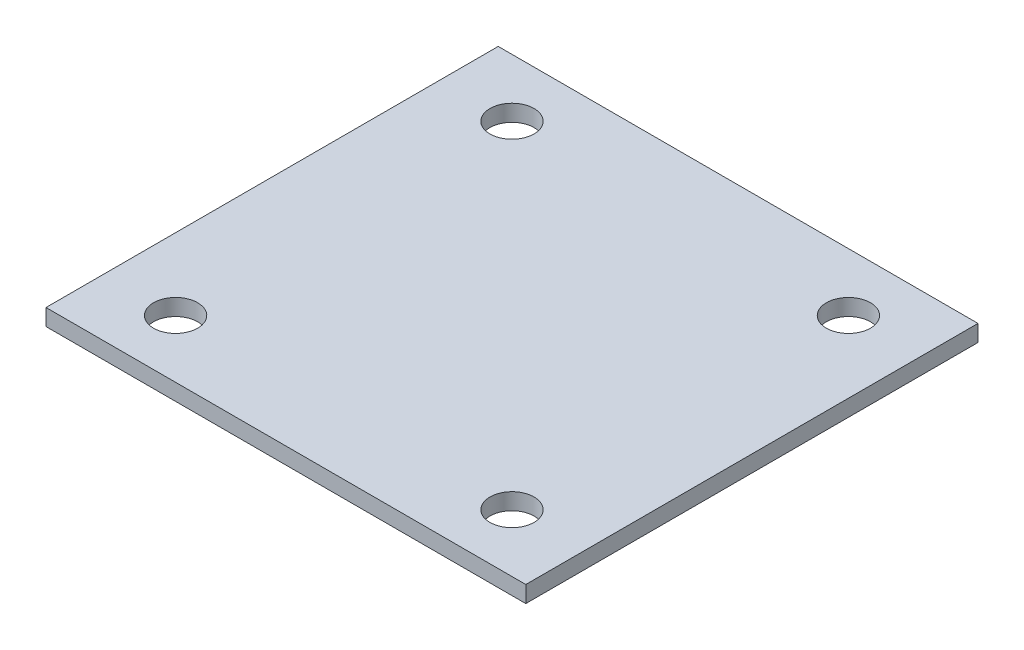
ISO-10303-21;
HEADER;
FILE_DESCRIPTION(('STEP AP214'),'2;1');
FILE_NAME('part.step','',(''),(''),'','','');
FILE_SCHEMA(('AUTOMOTIVE_DESIGN { 1 0 10303 214 1 1 1 1 }'));
ENDSEC;
DATA;
#1=APPLICATION_CONTEXT('core data for automotive mechanical design processes');
#2=APPLICATION_PROTOCOL_DEFINITION('international standard','automotive_design',2000,#1);
#3=PRODUCT_CONTEXT('',#1,'mechanical');
#4=PRODUCT('Part','Part','',(#3));
#5=PRODUCT_RELATED_PRODUCT_CATEGORY('part','',(#4));
#6=PRODUCT_DEFINITION_FORMATION('','',#4);
#7=PRODUCT_DEFINITION_CONTEXT('part definition',#1,'design');
#8=PRODUCT_DEFINITION('design','',#6,#7);
#9=PRODUCT_DEFINITION_SHAPE('','',#8);
#10=(LENGTH_UNIT() NAMED_UNIT(*) SI_UNIT(.MILLI.,.METRE.));
#11=(NAMED_UNIT(*) PLANE_ANGLE_UNIT() SI_UNIT($,.RADIAN.));
#12=(NAMED_UNIT(*) SI_UNIT($,.STERADIAN.) SOLID_ANGLE_UNIT());
#13=UNCERTAINTY_MEASURE_WITH_UNIT(LENGTH_MEASURE(1.E-05),#10,'distance_accuracy_value','');
#14=(GEOMETRIC_REPRESENTATION_CONTEXT(3) GLOBAL_UNCERTAINTY_ASSIGNED_CONTEXT((#13)) GLOBAL_UNIT_ASSIGNED_CONTEXT((#10,
#11,#12)) REPRESENTATION_CONTEXT('',''));
#15=CARTESIAN_POINT('',(0.,0.,0.));
#16=DIRECTION('',(0.,0.,1.));
#17=DIRECTION('',(1.,0.,0.));
#18=AXIS2_PLACEMENT_3D('',#15,#16,#17);
#19=CARTESIAN_POINT('',(0.,1.5,0.));
#20=DIRECTION('',(0.,-1.,0.));
#21=DIRECTION('',(0.,0.,-1.));
#22=AXIS2_PLACEMENT_3D('',#19,#20,#21);
#23=PLANE('',#22);
#24=DIRECTION('',(0.,0.,-1.));
#25=VECTOR('',#24,1.);
#26=CARTESIAN_POINT('',(21.75,1.5,20.5));
#27=LINE('',#26,#25);
#28=CARTESIAN_POINT('',(21.75,1.5,20.5));
#29=VERTEX_POINT('',#28);
#30=CARTESIAN_POINT('',(21.75,1.5,-20.5));
#31=VERTEX_POINT('',#30);
#32=EDGE_CURVE('E91',#29,#31,#27,.T.);
#33=ORIENTED_EDGE('',*,*,#32,.T.);
#34=DIRECTION('',(-1.,0.,0.));
#35=VECTOR('',#34,1.);
#36=CARTESIAN_POINT('',(-21.75,1.5,-20.5));
#37=LINE('',#36,#35);
#38=CARTESIAN_POINT('',(-21.75,1.5,-20.5));
#39=VERTEX_POINT('',#38);
#40=EDGE_CURVE('E86',#31,#39,#37,.T.);
#41=ORIENTED_EDGE('',*,*,#40,.T.);
#42=DIRECTION('',(0.,0.,1.));
#43=VECTOR('',#42,1.);
#44=CARTESIAN_POINT('',(-21.75,1.5,20.5));
#45=LINE('',#44,#43);
#46=CARTESIAN_POINT('',(-21.75,1.5,20.5));
#47=VERTEX_POINT('',#46);
#48=EDGE_CURVE('E89',#39,#47,#45,.T.);
#49=ORIENTED_EDGE('',*,*,#48,.T.);
#50=DIRECTION('',(1.,0.,0.));
#51=VECTOR('',#50,1.);
#52=CARTESIAN_POINT('',(-21.75,1.5,20.5));
#53=LINE('',#52,#51);
#54=EDGE_CURVE('E56',#47,#29,#53,.T.);
#55=ORIENTED_EDGE('',*,*,#54,.T.);
#56=EDGE_LOOP('',(#33,#41,#49,#55));
#57=FACE_BOUND('',#56,.T.);
#58=CARTESIAN_POINT('',(-15.25,1.5,-15.25));
#59=DIRECTION('',(0.,1.,0.));
#60=DIRECTION('',(0.,0.,1.));
#61=AXIS2_PLACEMENT_3D('',#58,#59,#60);
#62=CIRCLE('',#61,2.);
#63=CARTESIAN_POINT('',(-15.25,1.5,-13.25));
#64=VERTEX_POINT('',#63);
#65=EDGE_CURVE('E106',#64,#64,#62,.T.);
#66=ORIENTED_EDGE('',*,*,#65,.F.);
#67=EDGE_LOOP('',(#66));
#68=FACE_BOUND('',#67,.T.);
#69=CARTESIAN_POINT('',(15.25,1.5,-15.25));
#70=DIRECTION('',(0.,1.,0.));
#71=DIRECTION('',(0.,0.,-1.));
#72=AXIS2_PLACEMENT_3D('',#69,#70,#71);
#73=CIRCLE('',#72,2.);
#74=CARTESIAN_POINT('',(15.25,1.5,-17.25));
#75=VERTEX_POINT('',#74);
#76=EDGE_CURVE('E121',#75,#75,#73,.T.);
#77=ORIENTED_EDGE('',*,*,#76,.F.);
#78=EDGE_LOOP('',(#77));
#79=FACE_BOUND('',#78,.T.);
#80=CARTESIAN_POINT('',(15.25,1.5,15.25));
#81=DIRECTION('',(0.,1.,0.));
#82=DIRECTION('',(0.,0.,1.));
#83=AXIS2_PLACEMENT_3D('',#80,#81,#82);
#84=CIRCLE('',#83,2.00000000000001);
#85=CARTESIAN_POINT('',(15.25,1.5,17.25));
#86=VERTEX_POINT('',#85);
#87=EDGE_CURVE('E127',#86,#86,#84,.T.);
#88=ORIENTED_EDGE('',*,*,#87,.F.);
#89=EDGE_LOOP('',(#88));
#90=FACE_BOUND('',#89,.T.);
#91=CARTESIAN_POINT('',(-15.25,1.5,15.25));
#92=DIRECTION('',(0.,1.,0.));
#93=DIRECTION('',(0.,0.,-1.));
#94=AXIS2_PLACEMENT_3D('',#91,#92,#93);
#95=CIRCLE('',#94,2.);
#96=CARTESIAN_POINT('',(-15.25,1.5,13.25));
#97=VERTEX_POINT('',#96);
#98=EDGE_CURVE('E133',#97,#97,#95,.T.);
#99=ORIENTED_EDGE('',*,*,#98,.F.);
#100=EDGE_LOOP('',(#99));
#101=FACE_BOUND('',#100,.T.);
#102=ADVANCED_FACE('F39',(#57,#68,#79,#90,#101),#23,.F.);
#103=CARTESIAN_POINT('',(0.,0.,0.));
#104=DIRECTION('',(0.,-1.,0.));
#105=DIRECTION('',(0.,0.,-1.));
#106=AXIS2_PLACEMENT_3D('',#103,#104,#105);
#107=PLANE('',#106);
#108=CARTESIAN_POINT('',(15.25,0.,15.25));
#109=DIRECTION('',(0.,1.,0.));
#110=DIRECTION('',(0.,0.,1.));
#111=AXIS2_PLACEMENT_3D('',#108,#109,#110);
#112=CIRCLE('',#111,2.00000000000001);
#113=CARTESIAN_POINT('',(15.25,0.,17.25));
#114=VERTEX_POINT('',#113);
#115=EDGE_CURVE('E130',#114,#114,#112,.T.);
#116=ORIENTED_EDGE('',*,*,#115,.T.);
#117=EDGE_LOOP('',(#116));
#118=FACE_BOUND('',#117,.T.);
#119=CARTESIAN_POINT('',(-15.25,0.,-15.25));
#120=DIRECTION('',(0.,1.,0.));
#121=DIRECTION('',(0.,0.,1.));
#122=AXIS2_PLACEMENT_3D('',#119,#120,#121);
#123=CIRCLE('',#122,2.);
#124=CARTESIAN_POINT('',(-15.25,0.,-13.25));
#125=VERTEX_POINT('',#124);
#126=EDGE_CURVE('E118',#125,#125,#123,.T.);
#127=ORIENTED_EDGE('',*,*,#126,.T.);
#128=EDGE_LOOP('',(#127));
#129=FACE_BOUND('',#128,.T.);
#130=DIRECTION('',(0.,0.,-1.));
#131=VECTOR('',#130,1.);
#132=CARTESIAN_POINT('',(21.75,0.,20.5));
#133=LINE('',#132,#131);
#134=CARTESIAN_POINT('',(21.75,0.,20.5));
#135=VERTEX_POINT('',#134);
#136=CARTESIAN_POINT('',(21.75,0.,-20.5));
#137=VERTEX_POINT('',#136);
#138=EDGE_CURVE('E103',#135,#137,#133,.T.);
#139=ORIENTED_EDGE('',*,*,#138,.F.);
#140=DIRECTION('',(1.,0.,0.));
#141=VECTOR('',#140,1.);
#142=CARTESIAN_POINT('',(-21.75,0.,20.5));
#143=LINE('',#142,#141);
#144=CARTESIAN_POINT('',(-21.75,0.,20.5));
#145=VERTEX_POINT('',#144);
#146=EDGE_CURVE('E79',#145,#135,#143,.T.);
#147=ORIENTED_EDGE('',*,*,#146,.F.);
#148=DIRECTION('',(0.,0.,1.));
#149=VECTOR('',#148,1.);
#150=CARTESIAN_POINT('',(-21.75,0.,20.5));
#151=LINE('',#150,#149);
#152=CARTESIAN_POINT('',(-21.75,0.,-20.5));
#153=VERTEX_POINT('',#152);
#154=EDGE_CURVE('E73',#153,#145,#151,.T.);
#155=ORIENTED_EDGE('',*,*,#154,.F.);
#156=DIRECTION('',(-1.,0.,0.));
#157=VECTOR('',#156,1.);
#158=CARTESIAN_POINT('',(-21.75,0.,-20.5));
#159=LINE('',#158,#157);
#160=EDGE_CURVE('E95',#137,#153,#159,.T.);
#161=ORIENTED_EDGE('',*,*,#160,.F.);
#162=EDGE_LOOP('',(#139,#147,#155,#161));
#163=FACE_BOUND('',#162,.T.);
#164=CARTESIAN_POINT('',(15.25,0.,-15.25));
#165=DIRECTION('',(0.,1.,0.));
#166=DIRECTION('',(0.,0.,-1.));
#167=AXIS2_PLACEMENT_3D('',#164,#165,#166);
#168=CIRCLE('',#167,2.);
#169=CARTESIAN_POINT('',(15.25,0.,-17.25));
#170=VERTEX_POINT('',#169);
#171=EDGE_CURVE('E124',#170,#170,#168,.T.);
#172=ORIENTED_EDGE('',*,*,#171,.T.);
#173=EDGE_LOOP('',(#172));
#174=FACE_BOUND('',#173,.T.);
#175=CARTESIAN_POINT('',(-15.25,0.,15.25));
#176=DIRECTION('',(0.,1.,0.));
#177=DIRECTION('',(0.,0.,-1.));
#178=AXIS2_PLACEMENT_3D('',#175,#176,#177);
#179=CIRCLE('',#178,2.);
#180=CARTESIAN_POINT('',(-15.25,0.,13.25));
#181=VERTEX_POINT('',#180);
#182=EDGE_CURVE('E136',#181,#181,#179,.T.);
#183=ORIENTED_EDGE('',*,*,#182,.T.);
#184=EDGE_LOOP('',(#183));
#185=FACE_BOUND('',#184,.T.);
#186=ADVANCED_FACE('F114',(#118,#129,#163,#174,#185),#107,.T.);
#187=CARTESIAN_POINT('',(21.75,1.5,20.5));
#188=DIRECTION('',(-1.,0.,0.));
#189=DIRECTION('',(0.,0.,1.));
#190=AXIS2_PLACEMENT_3D('',#187,#188,#189);
#191=PLANE('',#190);
#192=ORIENTED_EDGE('',*,*,#138,.T.);
#193=DIRECTION('',(0.,-1.,0.));
#194=VECTOR('',#193,1.);
#195=CARTESIAN_POINT('',(21.75,1.5,-20.5));
#196=LINE('',#195,#194);
#197=EDGE_CURVE('E11',#31,#137,#196,.T.);
#198=ORIENTED_EDGE('',*,*,#197,.F.);
#199=ORIENTED_EDGE('',*,*,#32,.F.);
#200=DIRECTION('',(0.,-1.,0.));
#201=VECTOR('',#200,1.);
#202=CARTESIAN_POINT('',(21.75,1.5,20.5));
#203=LINE('',#202,#201);
#204=EDGE_CURVE('E99',#29,#135,#203,.T.);
#205=ORIENTED_EDGE('',*,*,#204,.T.);
#206=EDGE_LOOP('',(#192,#198,#199,#205));
#207=FACE_BOUND('',#206,.T.);
#208=ADVANCED_FACE('F41',(#207),#191,.F.);
#209=CARTESIAN_POINT('',(-21.75,1.5,-20.5));
#210=DIRECTION('',(0.,0.,1.));
#211=DIRECTION('',(1.,0.,0.));
#212=AXIS2_PLACEMENT_3D('',#209,#210,#211);
#213=PLANE('',#212);
#214=ORIENTED_EDGE('',*,*,#160,.T.);
#215=DIRECTION('',(0.,-1.,0.));
#216=VECTOR('',#215,1.);
#217=CARTESIAN_POINT('',(-21.75,1.5,-20.5));
#218=LINE('',#217,#216);
#219=EDGE_CURVE('E48',#39,#153,#218,.T.);
#220=ORIENTED_EDGE('',*,*,#219,.F.);
#221=ORIENTED_EDGE('',*,*,#40,.F.);
#222=ORIENTED_EDGE('',*,*,#197,.T.);
#223=EDGE_LOOP('',(#214,#220,#221,#222));
#224=FACE_BOUND('',#223,.T.);
#225=ADVANCED_FACE('F94',(#224),#213,.F.);
#226=CARTESIAN_POINT('',(-21.75,1.5,20.5));
#227=DIRECTION('',(1.,0.,0.));
#228=DIRECTION('',(0.,0.,-1.));
#229=AXIS2_PLACEMENT_3D('',#226,#227,#228);
#230=PLANE('',#229);
#231=ORIENTED_EDGE('',*,*,#154,.T.);
#232=DIRECTION('',(0.,-1.,0.));
#233=VECTOR('',#232,1.);
#234=CARTESIAN_POINT('',(-21.75,1.5,20.5));
#235=LINE('',#234,#233);
#236=EDGE_CURVE('E96',#47,#145,#235,.T.);
#237=ORIENTED_EDGE('',*,*,#236,.F.);
#238=ORIENTED_EDGE('',*,*,#48,.F.);
#239=ORIENTED_EDGE('',*,*,#219,.T.);
#240=EDGE_LOOP('',(#231,#237,#238,#239));
#241=FACE_BOUND('',#240,.T.);
#242=ADVANCED_FACE('F97',(#241),#230,.F.);
#243=CARTESIAN_POINT('',(-21.75,1.5,20.5));
#244=DIRECTION('',(0.,0.,-1.));
#245=DIRECTION('',(-1.,0.,0.));
#246=AXIS2_PLACEMENT_3D('',#243,#244,#245);
#247=PLANE('',#246);
#248=ORIENTED_EDGE('',*,*,#146,.T.);
#249=ORIENTED_EDGE('',*,*,#204,.F.);
#250=ORIENTED_EDGE('',*,*,#54,.F.);
#251=ORIENTED_EDGE('',*,*,#236,.T.);
#252=EDGE_LOOP('',(#248,#249,#250,#251));
#253=FACE_BOUND('',#252,.T.);
#254=ADVANCED_FACE('F111',(#253),#247,.F.);
#255=CARTESIAN_POINT('',(-15.25,1.5,-15.25));
#256=DIRECTION('',(0.,-1.,0.));
#257=DIRECTION('',(0.,0.,-1.));
#258=AXIS2_PLACEMENT_3D('',#255,#256,#257);
#259=CYLINDRICAL_SURFACE('',#258,2.);
#260=ORIENTED_EDGE('',*,*,#65,.T.);
#261=EDGE_LOOP('',(#260));
#262=FACE_BOUND('',#261,.T.);
#263=ORIENTED_EDGE('',*,*,#126,.F.);
#264=EDGE_LOOP('',(#263));
#265=FACE_BOUND('',#264,.T.);
#266=ADVANCED_FACE('F153',(#262,#265),#259,.F.);
#267=CARTESIAN_POINT('',(15.25,1.5,-15.25));
#268=DIRECTION('',(0.,-1.,0.));
#269=DIRECTION('',(0.,0.,-1.));
#270=AXIS2_PLACEMENT_3D('',#267,#268,#269);
#271=CYLINDRICAL_SURFACE('',#270,2.);
#272=ORIENTED_EDGE('',*,*,#76,.T.);
#273=EDGE_LOOP('',(#272));
#274=FACE_BOUND('',#273,.T.);
#275=ORIENTED_EDGE('',*,*,#171,.F.);
#276=EDGE_LOOP('',(#275));
#277=FACE_BOUND('',#276,.T.);
#278=ADVANCED_FACE('F207',(#274,#277),#271,.F.);
#279=CARTESIAN_POINT('',(15.25,1.5,15.25));
#280=DIRECTION('',(0.,-1.,0.));
#281=DIRECTION('',(0.,0.,-1.));
#282=AXIS2_PLACEMENT_3D('',#279,#280,#281);
#283=CYLINDRICAL_SURFACE('',#282,2.00000000000001);
#284=ORIENTED_EDGE('',*,*,#87,.T.);
#285=EDGE_LOOP('',(#284));
#286=FACE_BOUND('',#285,.T.);
#287=ORIENTED_EDGE('',*,*,#115,.F.);
#288=EDGE_LOOP('',(#287));
#289=FACE_BOUND('',#288,.T.);
#290=ADVANCED_FACE('F216',(#286,#289),#283,.F.);
#291=CARTESIAN_POINT('',(-15.25,1.5,15.25));
#292=DIRECTION('',(0.,-1.,0.));
#293=DIRECTION('',(0.,0.,-1.));
#294=AXIS2_PLACEMENT_3D('',#291,#292,#293);
#295=CYLINDRICAL_SURFACE('',#294,2.);
#296=ORIENTED_EDGE('',*,*,#98,.T.);
#297=EDGE_LOOP('',(#296));
#298=FACE_BOUND('',#297,.T.);
#299=ORIENTED_EDGE('',*,*,#182,.F.);
#300=EDGE_LOOP('',(#299));
#301=FACE_BOUND('',#300,.T.);
#302=ADVANCED_FACE('F142',(#298,#301),#295,.F.);
#303=CLOSED_SHELL('',(#102,#186,#208,#225,#242,#254,#266,#278,#290,#302));
#304=MANIFOLD_SOLID_BREP('B2',#303);
#305=ADVANCED_BREP_SHAPE_REPRESENTATION('',(#18,#304),#14);
#306=SHAPE_DEFINITION_REPRESENTATION(#9,#305);
ENDSEC;
END-ISO-10303-21;
